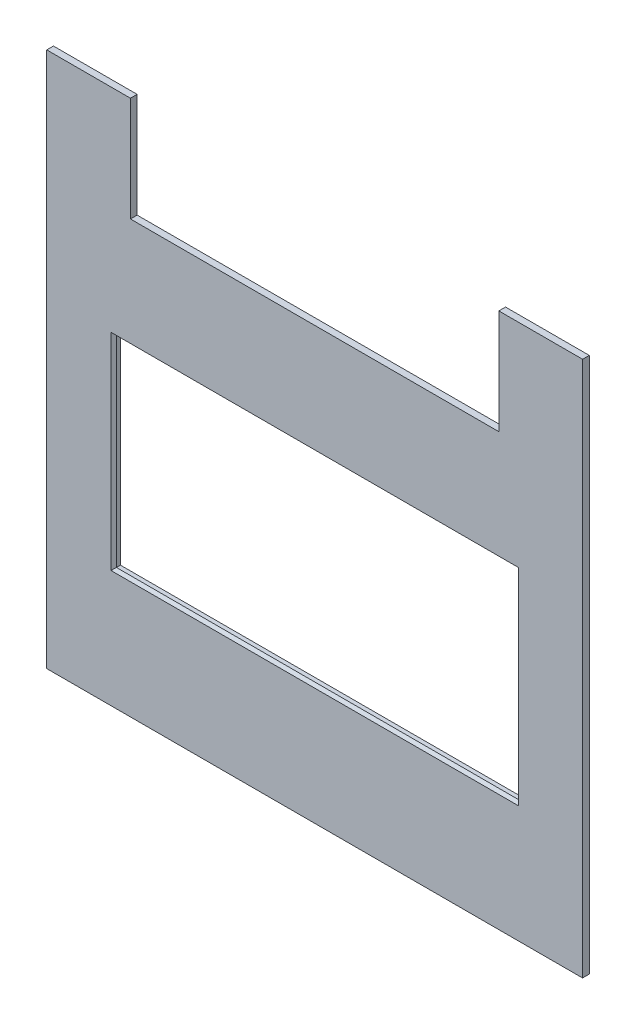
ISO-10303-21;
HEADER;
FILE_DESCRIPTION(('STEP AP214'),'2;1');
FILE_NAME('part.step','',(''),(''),'','','');
FILE_SCHEMA(('AUTOMOTIVE_DESIGN { 1 0 10303 214 1 1 1 1 }'));
ENDSEC;
DATA;
#1=APPLICATION_CONTEXT('core data for automotive mechanical design processes');
#2=APPLICATION_PROTOCOL_DEFINITION('international standard','automotive_design',2000,#1);
#3=PRODUCT_CONTEXT('',#1,'mechanical');
#4=PRODUCT('Part','Part','',(#3));
#5=PRODUCT_RELATED_PRODUCT_CATEGORY('part','',(#4));
#6=PRODUCT_DEFINITION_FORMATION('','',#4);
#7=PRODUCT_DEFINITION_CONTEXT('part definition',#1,'design');
#8=PRODUCT_DEFINITION('design','',#6,#7);
#9=PRODUCT_DEFINITION_SHAPE('','',#8);
#10=(LENGTH_UNIT() NAMED_UNIT(*) SI_UNIT(.MILLI.,.METRE.));
#11=(NAMED_UNIT(*) PLANE_ANGLE_UNIT() SI_UNIT($,.RADIAN.));
#12=(NAMED_UNIT(*) SI_UNIT($,.STERADIAN.) SOLID_ANGLE_UNIT());
#13=UNCERTAINTY_MEASURE_WITH_UNIT(LENGTH_MEASURE(1.E-05),#10,'distance_accuracy_value','');
#14=(GEOMETRIC_REPRESENTATION_CONTEXT(3) GLOBAL_UNCERTAINTY_ASSIGNED_CONTEXT((#13)) GLOBAL_UNIT_ASSIGNED_CONTEXT((#10,
#11,#12)) REPRESENTATION_CONTEXT('',''));
#15=CARTESIAN_POINT('',(0.,0.,0.));
#16=DIRECTION('',(0.,0.,1.));
#17=DIRECTION('',(1.,0.,0.));
#18=AXIS2_PLACEMENT_3D('',#15,#16,#17);
#19=CARTESIAN_POINT('',(-200.,200.,5.));
#20=DIRECTION('',(0.,-1.,0.));
#21=DIRECTION('',(0.,0.,-1.));
#22=AXIS2_PLACEMENT_3D('',#19,#20,#21);
#23=PLANE('',#22);
#24=DIRECTION('',(-1.,0.,0.));
#25=VECTOR('',#24,1.);
#26=CARTESIAN_POINT('',(-200.,200.,0.));
#27=LINE('',#26,#25);
#28=CARTESIAN_POINT('',(200.,200.,0.));
#29=VERTEX_POINT('',#28);
#30=CARTESIAN_POINT('',(137.5,200.,0.));
#31=VERTEX_POINT('',#30);
#32=EDGE_CURVE('E160',#29,#31,#27,.T.);
#33=ORIENTED_EDGE('',*,*,#32,.T.);
#34=DIRECTION('',(0.,0.,1.));
#35=VECTOR('',#34,1.);
#36=CARTESIAN_POINT('',(137.5,200.,0.));
#37=LINE('',#36,#35);
#38=CARTESIAN_POINT('',(137.5,200.,5.));
#39=VERTEX_POINT('',#38);
#40=EDGE_CURVE('E146',#31,#39,#37,.T.);
#41=ORIENTED_EDGE('',*,*,#40,.T.);
#42=DIRECTION('',(-1.,0.,0.));
#43=VECTOR('',#42,1.);
#44=CARTESIAN_POINT('',(-200.,200.,5.));
#45=LINE('',#44,#43);
#46=CARTESIAN_POINT('',(200.,200.,5.));
#47=VERTEX_POINT('',#46);
#48=EDGE_CURVE('E246',#47,#39,#45,.T.);
#49=ORIENTED_EDGE('',*,*,#48,.F.);
#50=DIRECTION('',(0.,0.,-1.));
#51=VECTOR('',#50,1.);
#52=CARTESIAN_POINT('',(200.,200.,5.));
#53=LINE('',#52,#51);
#54=EDGE_CURVE('E167',#47,#29,#53,.T.);
#55=ORIENTED_EDGE('',*,*,#54,.T.);
#56=EDGE_LOOP('',(#33,#41,#49,#55));
#57=FACE_BOUND('',#56,.T.);
#58=ADVANCED_FACE('F42',(#57),#23,.F.);
#59=CARTESIAN_POINT('',(200.,200.,5.));
#60=DIRECTION('',(-1.,0.,0.));
#61=DIRECTION('',(0.,-1.,0.));
#62=AXIS2_PLACEMENT_3D('',#59,#60,#61);
#63=PLANE('',#62);
#64=DIRECTION('',(0.,1.,0.));
#65=VECTOR('',#64,1.);
#66=CARTESIAN_POINT('',(200.,200.,0.));
#67=LINE('',#66,#65);
#68=CARTESIAN_POINT('',(200.,-200.,0.));
#69=VERTEX_POINT('',#68);
#70=EDGE_CURVE('E174',#69,#29,#67,.T.);
#71=ORIENTED_EDGE('',*,*,#70,.T.);
#72=ORIENTED_EDGE('',*,*,#54,.F.);
#73=DIRECTION('',(0.,1.,0.));
#74=VECTOR('',#73,1.);
#75=CARTESIAN_POINT('',(200.,200.,5.));
#76=LINE('',#75,#74);
#77=CARTESIAN_POINT('',(200.,-200.,5.));
#78=VERTEX_POINT('',#77);
#79=EDGE_CURVE('E179',#78,#47,#76,.T.);
#80=ORIENTED_EDGE('',*,*,#79,.F.);
#81=DIRECTION('',(0.,0.,-1.));
#82=VECTOR('',#81,1.);
#83=CARTESIAN_POINT('',(200.,-200.,5.));
#84=LINE('',#83,#82);
#85=EDGE_CURVE('E180',#78,#69,#84,.T.);
#86=ORIENTED_EDGE('',*,*,#85,.T.);
#87=EDGE_LOOP('',(#71,#72,#80,#86));
#88=FACE_BOUND('',#87,.T.);
#89=ADVANCED_FACE('F261',(#88),#63,.F.);
#90=CARTESIAN_POINT('',(-137.5,200.,5.));
#91=VERTEX_POINT('',#90);
#92=CARTESIAN_POINT('',(-200.,200.,5.));
#93=VERTEX_POINT('',#92);
#94=EDGE_CURVE('E245',#91,#93,#45,.T.);
#95=ORIENTED_EDGE('',*,*,#94,.F.);
#96=DIRECTION('',(0.,0.,1.));
#97=VECTOR('',#96,1.);
#98=CARTESIAN_POINT('',(-137.5,200.,0.));
#99=LINE('',#98,#97);
#100=CARTESIAN_POINT('',(-137.5,200.,0.));
#101=VERTEX_POINT('',#100);
#102=EDGE_CURVE('E155',#101,#91,#99,.T.);
#103=ORIENTED_EDGE('',*,*,#102,.F.);
#104=CARTESIAN_POINT('',(-200.,200.,0.));
#105=VERTEX_POINT('',#104);
#106=EDGE_CURVE('E170',#101,#105,#27,.T.);
#107=ORIENTED_EDGE('',*,*,#106,.T.);
#108=DIRECTION('',(0.,0.,-1.));
#109=VECTOR('',#108,1.);
#110=CARTESIAN_POINT('',(-200.,200.,5.));
#111=LINE('',#110,#109);
#112=EDGE_CURVE('E187',#93,#105,#111,.T.);
#113=ORIENTED_EDGE('',*,*,#112,.F.);
#114=EDGE_LOOP('',(#95,#103,#107,#113));
#115=FACE_BOUND('',#114,.T.);
#116=ADVANCED_FACE('F287',(#115),#23,.F.);
#117=CARTESIAN_POINT('',(-200.,200.,5.));
#118=DIRECTION('',(1.,0.,0.));
#119=DIRECTION('',(0.,1.,0.));
#120=AXIS2_PLACEMENT_3D('',#117,#118,#119);
#121=PLANE('',#120);
#122=DIRECTION('',(0.,-1.,0.));
#123=VECTOR('',#122,1.);
#124=CARTESIAN_POINT('',(-200.,200.,0.));
#125=LINE('',#124,#123);
#126=CARTESIAN_POINT('',(-200.,-200.,0.));
#127=VERTEX_POINT('',#126);
#128=EDGE_CURVE('E169',#105,#127,#125,.T.);
#129=ORIENTED_EDGE('',*,*,#128,.T.);
#130=DIRECTION('',(0.,0.,-1.));
#131=VECTOR('',#130,1.);
#132=CARTESIAN_POINT('',(-200.,-200.,5.));
#133=LINE('',#132,#131);
#134=CARTESIAN_POINT('',(-200.,-200.,5.));
#135=VERTEX_POINT('',#134);
#136=EDGE_CURVE('E183',#135,#127,#133,.T.);
#137=ORIENTED_EDGE('',*,*,#136,.F.);
#138=DIRECTION('',(0.,-1.,0.));
#139=VECTOR('',#138,1.);
#140=CARTESIAN_POINT('',(-200.,200.,5.));
#141=LINE('',#140,#139);
#142=EDGE_CURVE('E248',#93,#135,#141,.T.);
#143=ORIENTED_EDGE('',*,*,#142,.F.);
#144=ORIENTED_EDGE('',*,*,#112,.T.);
#145=EDGE_LOOP('',(#129,#137,#143,#144));
#146=FACE_BOUND('',#145,.T.);
#147=ADVANCED_FACE('F308',(#146),#121,.F.);
#148=CARTESIAN_POINT('',(-200.,-200.,5.));
#149=DIRECTION('',(0.,1.,0.));
#150=DIRECTION('',(0.,0.,1.));
#151=AXIS2_PLACEMENT_3D('',#148,#149,#150);
#152=PLANE('',#151);
#153=DIRECTION('',(1.,0.,0.));
#154=VECTOR('',#153,1.);
#155=CARTESIAN_POINT('',(-200.,-200.,0.));
#156=LINE('',#155,#154);
#157=EDGE_CURVE('E172',#127,#69,#156,.T.);
#158=ORIENTED_EDGE('',*,*,#157,.T.);
#159=ORIENTED_EDGE('',*,*,#85,.F.);
#160=DIRECTION('',(1.,0.,0.));
#161=VECTOR('',#160,1.);
#162=CARTESIAN_POINT('',(-200.,-200.,5.));
#163=LINE('',#162,#161);
#164=EDGE_CURVE('E184',#135,#78,#163,.T.);
#165=ORIENTED_EDGE('',*,*,#164,.F.);
#166=ORIENTED_EDGE('',*,*,#136,.T.);
#167=EDGE_LOOP('',(#158,#159,#165,#166));
#168=FACE_BOUND('',#167,.T.);
#169=ADVANCED_FACE('F258',(#168),#152,.F.);
#170=CARTESIAN_POINT('',(0.,0.,5.));
#171=DIRECTION('',(0.,0.,1.));
#172=DIRECTION('',(1.,0.,0.));
#173=AXIS2_PLACEMENT_3D('',#170,#171,#172);
#174=PLANE('',#173);
#175=DIRECTION('',(0.,1.,0.));
#176=VECTOR('',#175,1.);
#177=CARTESIAN_POINT('',(137.5,200.,5.));
#178=LINE('',#177,#176);
#179=CARTESIAN_POINT('',(137.5,121.931575511852,5.));
#180=VERTEX_POINT('',#179);
#181=EDGE_CURVE('E151',#180,#39,#178,.T.);
#182=ORIENTED_EDGE('',*,*,#181,.F.);
#183=DIRECTION('',(1.,0.,0.));
#184=VECTOR('',#183,1.);
#185=CARTESIAN_POINT('',(-137.5,121.931575511852,5.));
#186=LINE('',#185,#184);
#187=CARTESIAN_POINT('',(-137.5,121.931575511852,5.));
#188=VERTEX_POINT('',#187);
#189=EDGE_CURVE('E164',#188,#180,#186,.T.);
#190=ORIENTED_EDGE('',*,*,#189,.F.);
#191=DIRECTION('',(0.,-1.,0.));
#192=VECTOR('',#191,1.);
#193=CARTESIAN_POINT('',(-137.5,200.,5.));
#194=LINE('',#193,#192);
#195=EDGE_CURVE('E274',#91,#188,#194,.T.);
#196=ORIENTED_EDGE('',*,*,#195,.F.);
#197=ORIENTED_EDGE('',*,*,#94,.T.);
#198=ORIENTED_EDGE('',*,*,#142,.T.);
#199=ORIENTED_EDGE('',*,*,#164,.T.);
#200=ORIENTED_EDGE('',*,*,#79,.T.);
#201=ORIENTED_EDGE('',*,*,#48,.T.);
#202=EDGE_LOOP('',(#182,#190,#196,#197,#198,#199,#200,#201));
#203=FACE_BOUND('',#202,.T.);
#204=DIRECTION('',(0.,1.,0.));
#205=VECTOR('',#204,1.);
#206=CARTESIAN_POINT('',(-152.,39.43,5.));
#207=LINE('',#206,#205);
#208=CARTESIAN_POINT('',(-152.,-112.59,5.));
#209=VERTEX_POINT('',#208);
#210=CARTESIAN_POINT('',(-152.,41.4300000000001,5.));
#211=VERTEX_POINT('',#210);
#212=EDGE_CURVE('E206',#209,#211,#207,.T.);
#213=ORIENTED_EDGE('',*,*,#212,.T.);
#214=DIRECTION('',(1.,0.,0.));
#215=VECTOR('',#214,1.);
#216=CARTESIAN_POINT('',(150.,41.4300000000001,5.));
#217=LINE('',#216,#215);
#218=CARTESIAN_POINT('',(152.,41.4300000000001,5.));
#219=VERTEX_POINT('',#218);
#220=EDGE_CURVE('E212',#211,#219,#217,.T.);
#221=ORIENTED_EDGE('',*,*,#220,.T.);
#222=DIRECTION('',(0.,-1.,0.));
#223=VECTOR('',#222,1.);
#224=CARTESIAN_POINT('',(152.,-110.59,5.));
#225=LINE('',#224,#223);
#226=CARTESIAN_POINT('',(152.,-112.59,5.));
#227=VERTEX_POINT('',#226);
#228=EDGE_CURVE('E210',#219,#227,#225,.T.);
#229=ORIENTED_EDGE('',*,*,#228,.T.);
#230=DIRECTION('',(-1.,0.,0.));
#231=VECTOR('',#230,1.);
#232=CARTESIAN_POINT('',(-150.,-112.59,5.));
#233=LINE('',#232,#231);
#234=EDGE_CURVE('E208',#227,#209,#233,.T.);
#235=ORIENTED_EDGE('',*,*,#234,.T.);
#236=EDGE_LOOP('',(#213,#221,#229,#235));
#237=FACE_BOUND('',#236,.T.);
#238=ADVANCED_FACE('F252',(#203,#237),#174,.T.);
#239=CARTESIAN_POINT('',(0.,0.,0.));
#240=DIRECTION('',(0.,0.,1.));
#241=DIRECTION('',(1.,0.,0.));
#242=AXIS2_PLACEMENT_3D('',#239,#240,#241);
#243=PLANE('',#242);
#244=DIRECTION('',(1.,0.,0.));
#245=VECTOR('',#244,1.);
#246=CARTESIAN_POINT('',(0.,-110.59,0.));
#247=LINE('',#246,#245);
#248=CARTESIAN_POINT('',(-150.,-110.59,0.));
#249=VERTEX_POINT('',#248);
#250=CARTESIAN_POINT('',(150.,-110.59,0.));
#251=VERTEX_POINT('',#250);
#252=EDGE_CURVE('E197',#249,#251,#247,.T.);
#253=ORIENTED_EDGE('',*,*,#252,.T.);
#254=DIRECTION('',(0.,1.,0.));
#255=VECTOR('',#254,1.);
#256=CARTESIAN_POINT('',(150.,0.,0.));
#257=LINE('',#256,#255);
#258=CARTESIAN_POINT('',(150.,39.43,0.));
#259=VERTEX_POINT('',#258);
#260=EDGE_CURVE('E200',#251,#259,#257,.T.);
#261=ORIENTED_EDGE('',*,*,#260,.T.);
#262=DIRECTION('',(-1.,0.,0.));
#263=VECTOR('',#262,1.);
#264=CARTESIAN_POINT('',(0.,39.43,0.));
#265=LINE('',#264,#263);
#266=CARTESIAN_POINT('',(-150.,39.43,0.));
#267=VERTEX_POINT('',#266);
#268=EDGE_CURVE('E191',#259,#267,#265,.T.);
#269=ORIENTED_EDGE('',*,*,#268,.T.);
#270=DIRECTION('',(0.,-1.,0.));
#271=VECTOR('',#270,1.);
#272=CARTESIAN_POINT('',(-150.,0.,0.));
#273=LINE('',#272,#271);
#274=EDGE_CURVE('E194',#267,#249,#273,.T.);
#275=ORIENTED_EDGE('',*,*,#274,.T.);
#276=EDGE_LOOP('',(#253,#261,#269,#275));
#277=FACE_BOUND('',#276,.T.);
#278=DIRECTION('',(1.,0.,0.));
#279=VECTOR('',#278,1.);
#280=CARTESIAN_POINT('',(-137.5,121.931575511852,0.));
#281=LINE('',#280,#279);
#282=CARTESIAN_POINT('',(-137.5,121.931575511852,0.));
#283=VERTEX_POINT('',#282);
#284=CARTESIAN_POINT('',(137.5,121.931575511852,0.));
#285=VERTEX_POINT('',#284);
#286=EDGE_CURVE('E60',#283,#285,#281,.T.);
#287=ORIENTED_EDGE('',*,*,#286,.T.);
#288=DIRECTION('',(0.,1.,0.));
#289=VECTOR('',#288,1.);
#290=CARTESIAN_POINT('',(137.5,200.,0.));
#291=LINE('',#290,#289);
#292=EDGE_CURVE('E149',#285,#31,#291,.T.);
#293=ORIENTED_EDGE('',*,*,#292,.T.);
#294=ORIENTED_EDGE('',*,*,#32,.F.);
#295=ORIENTED_EDGE('',*,*,#70,.F.);
#296=ORIENTED_EDGE('',*,*,#157,.F.);
#297=ORIENTED_EDGE('',*,*,#128,.F.);
#298=ORIENTED_EDGE('',*,*,#106,.F.);
#299=DIRECTION('',(0.,-1.,0.));
#300=VECTOR('',#299,1.);
#301=CARTESIAN_POINT('',(-137.5,200.,0.));
#302=LINE('',#301,#300);
#303=EDGE_CURVE('E163',#101,#283,#302,.T.);
#304=ORIENTED_EDGE('',*,*,#303,.T.);
#305=EDGE_LOOP('',(#287,#293,#294,#295,#296,#297,#298,#304));
#306=FACE_BOUND('',#305,.T.);
#307=ADVANCED_FACE('F158',(#277,#306),#243,.F.);
#308=CARTESIAN_POINT('',(150.,39.43,-5.));
#309=DIRECTION('',(1.,0.,0.));
#310=DIRECTION('',(0.,0.,-1.));
#311=AXIS2_PLACEMENT_3D('',#308,#309,#310);
#312=PLANE('',#311);
#313=DIRECTION('',(0.,0.,1.));
#314=VECTOR('',#313,1.);
#315=CARTESIAN_POINT('',(150.,-110.59,-5.));
#316=LINE('',#315,#314);
#317=CARTESIAN_POINT('',(150.,-110.59,2.99999999999989));
#318=VERTEX_POINT('',#317);
#319=EDGE_CURVE('E262',#251,#318,#316,.T.);
#320=ORIENTED_EDGE('',*,*,#319,.T.);
#321=DIRECTION('',(0.,1.,0.));
#322=VECTOR('',#321,1.);
#323=CARTESIAN_POINT('',(150.,39.43,2.99999999999989));
#324=LINE('',#323,#322);
#325=CARTESIAN_POINT('',(150.,39.43,2.99999999999989));
#326=VERTEX_POINT('',#325);
#327=EDGE_CURVE('E215',#318,#326,#324,.T.);
#328=ORIENTED_EDGE('',*,*,#327,.T.);
#329=DIRECTION('',(0.,0.,1.));
#330=VECTOR('',#329,1.);
#331=CARTESIAN_POINT('',(150.,39.43,-5.));
#332=LINE('',#331,#330);
#333=EDGE_CURVE('E228',#259,#326,#332,.T.);
#334=ORIENTED_EDGE('',*,*,#333,.F.);
#335=ORIENTED_EDGE('',*,*,#260,.F.);
#336=EDGE_LOOP('',(#320,#328,#334,#335));
#337=FACE_BOUND('',#336,.T.);
#338=ADVANCED_FACE('F320',(#337),#312,.F.);
#339=CARTESIAN_POINT('',(-150.,-110.59,-5.));
#340=DIRECTION('',(0.,-1.,0.));
#341=DIRECTION('',(0.,0.,-1.));
#342=AXIS2_PLACEMENT_3D('',#339,#340,#341);
#343=PLANE('',#342);
#344=DIRECTION('',(0.,0.,1.));
#345=VECTOR('',#344,1.);
#346=CARTESIAN_POINT('',(-150.,-110.59,-5.));
#347=LINE('',#346,#345);
#348=CARTESIAN_POINT('',(-150.,-110.59,2.99999999999989));
#349=VERTEX_POINT('',#348);
#350=EDGE_CURVE('E239',#249,#349,#347,.T.);
#351=ORIENTED_EDGE('',*,*,#350,.T.);
#352=DIRECTION('',(1.,0.,0.));
#353=VECTOR('',#352,1.);
#354=CARTESIAN_POINT('',(150.,-110.59,2.99999999999989));
#355=LINE('',#354,#353);
#356=EDGE_CURVE('E52',#349,#318,#355,.T.);
#357=ORIENTED_EDGE('',*,*,#356,.T.);
#358=ORIENTED_EDGE('',*,*,#319,.F.);
#359=ORIENTED_EDGE('',*,*,#252,.F.);
#360=EDGE_LOOP('',(#351,#357,#358,#359));
#361=FACE_BOUND('',#360,.T.);
#362=ADVANCED_FACE('F326',(#361),#343,.F.);
#363=CARTESIAN_POINT('',(-150.,39.43,-5.));
#364=DIRECTION('',(-1.,0.,0.));
#365=DIRECTION('',(0.,0.,1.));
#366=AXIS2_PLACEMENT_3D('',#363,#364,#365);
#367=PLANE('',#366);
#368=DIRECTION('',(0.,0.,1.));
#369=VECTOR('',#368,1.);
#370=CARTESIAN_POINT('',(-150.,39.43,-5.));
#371=LINE('',#370,#369);
#372=CARTESIAN_POINT('',(-150.,39.43,2.99999999999989));
#373=VERTEX_POINT('',#372);
#374=EDGE_CURVE('E234',#267,#373,#371,.T.);
#375=ORIENTED_EDGE('',*,*,#374,.T.);
#376=DIRECTION('',(0.,-1.,0.));
#377=VECTOR('',#376,1.);
#378=CARTESIAN_POINT('',(-150.,-110.59,2.99999999999989));
#379=LINE('',#378,#377);
#380=EDGE_CURVE('E11',#373,#349,#379,.T.);
#381=ORIENTED_EDGE('',*,*,#380,.T.);
#382=ORIENTED_EDGE('',*,*,#350,.F.);
#383=ORIENTED_EDGE('',*,*,#274,.F.);
#384=EDGE_LOOP('',(#375,#381,#382,#383));
#385=FACE_BOUND('',#384,.T.);
#386=ADVANCED_FACE('F330',(#385),#367,.F.);
#387=CARTESIAN_POINT('',(-150.,39.43,-5.));
#388=DIRECTION('',(0.,1.,0.));
#389=DIRECTION('',(0.,0.,1.));
#390=AXIS2_PLACEMENT_3D('',#387,#388,#389);
#391=PLANE('',#390);
#392=ORIENTED_EDGE('',*,*,#333,.T.);
#393=DIRECTION('',(-1.,0.,0.));
#394=VECTOR('',#393,1.);
#395=CARTESIAN_POINT('',(-150.,39.43,2.99999999999989));
#396=LINE('',#395,#394);
#397=EDGE_CURVE('E203',#326,#373,#396,.T.);
#398=ORIENTED_EDGE('',*,*,#397,.T.);
#399=ORIENTED_EDGE('',*,*,#374,.F.);
#400=ORIENTED_EDGE('',*,*,#268,.F.);
#401=EDGE_LOOP('',(#392,#398,#399,#400));
#402=FACE_BOUND('',#401,.T.);
#403=ADVANCED_FACE('F327',(#402),#391,.F.);
#404=CARTESIAN_POINT('',(-150.,-110.59,2.99999999999989));
#405=DIRECTION('',(0.,0.707106781186548,0.707106781186548));
#406=DIRECTION('',(-1.,0.,0.));
#407=AXIS2_PLACEMENT_3D('',#404,#405,#406);
#408=PLANE('',#407);
#409=DIRECTION('',(0.577350269189626,0.577350269189626,-0.577350269189626));
#410=VECTOR('',#409,1.);
#411=CARTESIAN_POINT('',(-150.,-110.59,2.99999999999989));
#412=LINE('',#411,#410);
#413=EDGE_CURVE('E222',#209,#349,#412,.T.);
#414=ORIENTED_EDGE('',*,*,#413,.F.);
#415=ORIENTED_EDGE('',*,*,#234,.F.);
#416=DIRECTION('',(-0.577350269189626,0.577350269189626,-0.577350269189626));
#417=VECTOR('',#416,1.);
#418=CARTESIAN_POINT('',(99.9933333333334,-60.5833333333333,-47.0066666666668));
#419=LINE('',#418,#417);
#420=EDGE_CURVE('E47',#318,#227,#419,.F.);
#421=ORIENTED_EDGE('',*,*,#420,.F.);
#422=ORIENTED_EDGE('',*,*,#356,.F.);
#423=EDGE_LOOP('',(#414,#415,#421,#422));
#424=FACE_BOUND('',#423,.T.);
#425=ADVANCED_FACE('F45',(#424),#408,.T.);
#426=CARTESIAN_POINT('',(150.,39.43,2.99999999999989));
#427=DIRECTION('',(-0.707106781186548,0.,0.707106781186548));
#428=DIRECTION('',(0.,-1.,0.));
#429=AXIS2_PLACEMENT_3D('',#426,#427,#428);
#430=PLANE('',#429);
#431=ORIENTED_EDGE('',*,*,#420,.T.);
#432=ORIENTED_EDGE('',*,*,#228,.F.);
#433=DIRECTION('',(-0.577350269189626,-0.577350269189626,-0.577350269189626));
#434=VECTOR('',#433,1.);
#435=CARTESIAN_POINT('',(50.,-60.57,-97.0000000000001));
#436=LINE('',#435,#434);
#437=EDGE_CURVE('E220',#326,#219,#436,.F.);
#438=ORIENTED_EDGE('',*,*,#437,.F.);
#439=ORIENTED_EDGE('',*,*,#327,.F.);
#440=EDGE_LOOP('',(#431,#432,#438,#439));
#441=FACE_BOUND('',#440,.T.);
#442=ADVANCED_FACE('F341',(#441),#430,.T.);
#443=CARTESIAN_POINT('',(-150.,39.43,2.99999999999989));
#444=DIRECTION('',(0.707106781186548,0.,0.707106781186548));
#445=DIRECTION('',(0.,1.,0.));
#446=AXIS2_PLACEMENT_3D('',#443,#444,#445);
#447=PLANE('',#446);
#448=ORIENTED_EDGE('',*,*,#413,.T.);
#449=ORIENTED_EDGE('',*,*,#380,.F.);
#450=DIRECTION('',(-0.577350269189626,0.577350269189626,0.577350269189626));
#451=VECTOR('',#450,1.);
#452=CARTESIAN_POINT('',(-150.,39.43,2.99999999999989));
#453=LINE('',#452,#451);
#454=EDGE_CURVE('E218',#211,#373,#453,.F.);
#455=ORIENTED_EDGE('',*,*,#454,.F.);
#456=ORIENTED_EDGE('',*,*,#212,.F.);
#457=EDGE_LOOP('',(#448,#449,#455,#456));
#458=FACE_BOUND('',#457,.T.);
#459=ADVANCED_FACE('F346',(#458),#447,.T.);
#460=CARTESIAN_POINT('',(-150.,39.43,2.99999999999989));
#461=DIRECTION('',(0.,-0.707106781186548,0.707106781186548));
#462=DIRECTION('',(1.,0.,0.));
#463=AXIS2_PLACEMENT_3D('',#460,#461,#462);
#464=PLANE('',#463);
#465=ORIENTED_EDGE('',*,*,#437,.T.);
#466=ORIENTED_EDGE('',*,*,#220,.F.);
#467=ORIENTED_EDGE('',*,*,#454,.T.);
#468=ORIENTED_EDGE('',*,*,#397,.F.);
#469=EDGE_LOOP('',(#465,#466,#467,#468));
#470=FACE_BOUND('',#469,.T.);
#471=ADVANCED_FACE('F298',(#470),#464,.T.);
#472=CARTESIAN_POINT('',(137.5,200.,0.));
#473=DIRECTION('',(1.,0.,0.));
#474=DIRECTION('',(0.,0.,-1.));
#475=AXIS2_PLACEMENT_3D('',#472,#473,#474);
#476=PLANE('',#475);
#477=ORIENTED_EDGE('',*,*,#181,.T.);
#478=ORIENTED_EDGE('',*,*,#40,.F.);
#479=ORIENTED_EDGE('',*,*,#292,.F.);
#480=DIRECTION('',(0.,0.,1.));
#481=VECTOR('',#480,1.);
#482=CARTESIAN_POINT('',(137.5,121.931575511852,0.));
#483=LINE('',#482,#481);
#484=EDGE_CURVE('E221',#285,#180,#483,.T.);
#485=ORIENTED_EDGE('',*,*,#484,.T.);
#486=EDGE_LOOP('',(#477,#478,#479,#485));
#487=FACE_BOUND('',#486,.T.);
#488=ADVANCED_FACE('F148',(#487),#476,.F.);
#489=CARTESIAN_POINT('',(-137.5,121.931575511852,0.));
#490=DIRECTION('',(0.,-1.,0.));
#491=DIRECTION('',(0.,0.,-1.));
#492=AXIS2_PLACEMENT_3D('',#489,#490,#491);
#493=PLANE('',#492);
#494=ORIENTED_EDGE('',*,*,#189,.T.);
#495=ORIENTED_EDGE('',*,*,#484,.F.);
#496=ORIENTED_EDGE('',*,*,#286,.F.);
#497=DIRECTION('',(0.,0.,1.));
#498=VECTOR('',#497,1.);
#499=CARTESIAN_POINT('',(-137.5,121.931575511852,0.));
#500=LINE('',#499,#498);
#501=EDGE_CURVE('E269',#283,#188,#500,.T.);
#502=ORIENTED_EDGE('',*,*,#501,.T.);
#503=EDGE_LOOP('',(#494,#495,#496,#502));
#504=FACE_BOUND('',#503,.T.);
#505=ADVANCED_FACE('F290',(#504),#493,.F.);
#506=CARTESIAN_POINT('',(-137.5,200.,0.));
#507=DIRECTION('',(-1.,0.,0.));
#508=DIRECTION('',(0.,-1.,0.));
#509=AXIS2_PLACEMENT_3D('',#506,#507,#508);
#510=PLANE('',#509);
#511=ORIENTED_EDGE('',*,*,#195,.T.);
#512=ORIENTED_EDGE('',*,*,#501,.F.);
#513=ORIENTED_EDGE('',*,*,#303,.F.);
#514=ORIENTED_EDGE('',*,*,#102,.T.);
#515=EDGE_LOOP('',(#511,#512,#513,#514));
#516=FACE_BOUND('',#515,.T.);
#517=ADVANCED_FACE('F283',(#516),#510,.F.);
#518=CLOSED_SHELL('',(#58,#89,#116,#147,#169,#238,#307,#338,#362,#386,#403,#425,#442,#459,#471,
#488,#505,#517));
#519=MANIFOLD_SOLID_BREP('B2',#518);
#520=ADVANCED_BREP_SHAPE_REPRESENTATION('',(#18,#519),#14);
#521=SHAPE_DEFINITION_REPRESENTATION(#9,#520);
ENDSEC;
END-ISO-10303-21;
